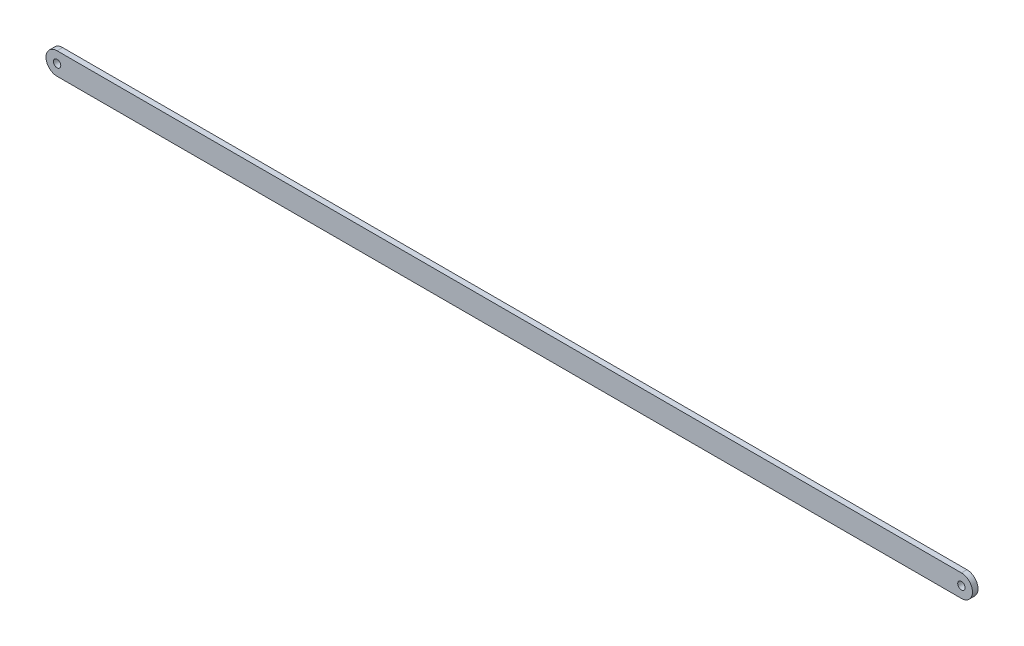
ISO-10303-21;
HEADER;
FILE_DESCRIPTION(('STEP AP214'),'2;1');
FILE_NAME('part.step','',(''),(''),'','','');
FILE_SCHEMA(('AUTOMOTIVE_DESIGN { 1 0 10303 214 1 1 1 1 }'));
ENDSEC;
DATA;
#1=APPLICATION_CONTEXT('core data for automotive mechanical design processes');
#2=APPLICATION_PROTOCOL_DEFINITION('international standard','automotive_design',2000,#1);
#3=PRODUCT_CONTEXT('',#1,'mechanical');
#4=PRODUCT('Part','Part','',(#3));
#5=PRODUCT_RELATED_PRODUCT_CATEGORY('part','',(#4));
#6=PRODUCT_DEFINITION_FORMATION('','',#4);
#7=PRODUCT_DEFINITION_CONTEXT('part definition',#1,'design');
#8=PRODUCT_DEFINITION('design','',#6,#7);
#9=PRODUCT_DEFINITION_SHAPE('','',#8);
#10=(LENGTH_UNIT() NAMED_UNIT(*) SI_UNIT(.MILLI.,.METRE.));
#11=(NAMED_UNIT(*) PLANE_ANGLE_UNIT() SI_UNIT($,.RADIAN.));
#12=(NAMED_UNIT(*) SI_UNIT($,.STERADIAN.) SOLID_ANGLE_UNIT());
#13=UNCERTAINTY_MEASURE_WITH_UNIT(LENGTH_MEASURE(1.E-05),#10,'distance_accuracy_value','');
#14=(GEOMETRIC_REPRESENTATION_CONTEXT(3) GLOBAL_UNCERTAINTY_ASSIGNED_CONTEXT((#13)) GLOBAL_UNIT_ASSIGNED_CONTEXT((#10,
#11,#12)) REPRESENTATION_CONTEXT('',''));
#15=CARTESIAN_POINT('',(0.,0.,0.));
#16=DIRECTION('',(0.,0.,1.));
#17=DIRECTION('',(1.,0.,0.));
#18=AXIS2_PLACEMENT_3D('',#15,#16,#17);
#19=CARTESIAN_POINT('',(-35.3127241673783,0.,3.));
#20=DIRECTION('',(0.,0.,1.));
#21=DIRECTION('',(1.,0.,0.));
#22=AXIS2_PLACEMENT_3D('',#19,#20,#21);
#23=PLANE('',#22);
#24=CARTESIAN_POINT('',(-35.3127241673783,0.,3.));
#25=DIRECTION('',(0.,0.,1.));
#26=DIRECTION('',(1.,0.,0.));
#27=AXIS2_PLACEMENT_3D('',#24,#25,#26);
#28=CIRCLE('',#27,2.);
#29=CARTESIAN_POINT('',(-33.3127241673783,0.,3.));
#30=VERTEX_POINT('',#29);
#31=EDGE_CURVE('E100',#30,#30,#28,.T.);
#32=ORIENTED_EDGE('',*,*,#31,.F.);
#33=EDGE_LOOP('',(#32));
#34=FACE_BOUND('',#33,.T.);
#35=CARTESIAN_POINT('',(-35.3127241673783,0.,3.));
#36=DIRECTION('',(0.,0.,1.));
#37=DIRECTION('',(1.,0.,0.));
#38=AXIS2_PLACEMENT_3D('',#35,#36,#37);
#39=CIRCLE('',#38,6.);
#40=CARTESIAN_POINT('',(-35.3127241673783,6.,3.));
#41=VERTEX_POINT('',#40);
#42=CARTESIAN_POINT('',(-35.3127241673783,-6.,3.));
#43=VERTEX_POINT('',#42);
#44=EDGE_CURVE('E85',#41,#43,#39,.T.);
#45=ORIENTED_EDGE('',*,*,#44,.T.);
#46=DIRECTION('',(1.,0.,0.));
#47=VECTOR('',#46,1.);
#48=CARTESIAN_POINT('',(-35.3127241673783,-6.,3.));
#49=LINE('',#48,#47);
#50=CARTESIAN_POINT('',(454.687275832622,-6.,3.));
#51=VERTEX_POINT('',#50);
#52=EDGE_CURVE('E80',#43,#51,#49,.T.);
#53=ORIENTED_EDGE('',*,*,#52,.T.);
#54=CARTESIAN_POINT('',(454.687275832622,0.,3.));
#55=DIRECTION('',(0.,0.,1.));
#56=DIRECTION('',(1.,0.,0.));
#57=AXIS2_PLACEMENT_3D('',#54,#55,#56);
#58=CIRCLE('',#57,6.);
#59=CARTESIAN_POINT('',(454.687275832622,6.,3.));
#60=VERTEX_POINT('',#59);
#61=EDGE_CURVE('E83',#51,#60,#58,.T.);
#62=ORIENTED_EDGE('',*,*,#61,.T.);
#63=DIRECTION('',(-1.,0.,0.));
#64=VECTOR('',#63,1.);
#65=CARTESIAN_POINT('',(-35.3127241673783,6.,3.));
#66=LINE('',#65,#64);
#67=EDGE_CURVE('E50',#60,#41,#66,.T.);
#68=ORIENTED_EDGE('',*,*,#67,.T.);
#69=EDGE_LOOP('',(#45,#53,#62,#68));
#70=FACE_BOUND('',#69,.T.);
#71=CARTESIAN_POINT('',(454.687275832622,0.,3.));
#72=DIRECTION('',(0.,0.,1.));
#73=DIRECTION('',(1.,0.,0.));
#74=AXIS2_PLACEMENT_3D('',#71,#72,#73);
#75=CIRCLE('',#74,2.);
#76=CARTESIAN_POINT('',(456.687275832622,0.,3.));
#77=VERTEX_POINT('',#76);
#78=EDGE_CURVE('E115',#77,#77,#75,.T.);
#79=ORIENTED_EDGE('',*,*,#78,.F.);
#80=EDGE_LOOP('',(#79));
#81=FACE_BOUND('',#80,.T.);
#82=ADVANCED_FACE('F33',(#34,#70,#81),#23,.T.);
#83=CARTESIAN_POINT('',(-35.3127241673783,0.,0.));
#84=DIRECTION('',(0.,0.,1.));
#85=DIRECTION('',(1.,0.,0.));
#86=AXIS2_PLACEMENT_3D('',#83,#84,#85);
#87=PLANE('',#86);
#88=CARTESIAN_POINT('',(-35.3127241673783,0.,0.));
#89=DIRECTION('',(0.,0.,1.));
#90=DIRECTION('',(1.,0.,0.));
#91=AXIS2_PLACEMENT_3D('',#88,#89,#90);
#92=CIRCLE('',#91,2.);
#93=CARTESIAN_POINT('',(-33.3127241673783,0.,0.));
#94=VERTEX_POINT('',#93);
#95=EDGE_CURVE('E112',#94,#94,#92,.T.);
#96=ORIENTED_EDGE('',*,*,#95,.T.);
#97=EDGE_LOOP('',(#96));
#98=FACE_BOUND('',#97,.T.);
#99=CARTESIAN_POINT('',(-35.3127241673783,0.,0.));
#100=DIRECTION('',(0.,0.,1.));
#101=DIRECTION('',(1.,0.,0.));
#102=AXIS2_PLACEMENT_3D('',#99,#100,#101);
#103=CIRCLE('',#102,6.);
#104=CARTESIAN_POINT('',(-35.3127241673783,6.,0.));
#105=VERTEX_POINT('',#104);
#106=CARTESIAN_POINT('',(-35.3127241673783,-6.,0.));
#107=VERTEX_POINT('',#106);
#108=EDGE_CURVE('E97',#105,#107,#103,.T.);
#109=ORIENTED_EDGE('',*,*,#108,.F.);
#110=DIRECTION('',(-1.,0.,0.));
#111=VECTOR('',#110,1.);
#112=CARTESIAN_POINT('',(-35.3127241673783,6.,0.));
#113=LINE('',#112,#111);
#114=CARTESIAN_POINT('',(454.687275832622,6.,0.));
#115=VERTEX_POINT('',#114);
#116=EDGE_CURVE('E73',#115,#105,#113,.T.);
#117=ORIENTED_EDGE('',*,*,#116,.F.);
#118=CARTESIAN_POINT('',(454.687275832622,0.,0.));
#119=DIRECTION('',(0.,0.,1.));
#120=DIRECTION('',(1.,0.,0.));
#121=AXIS2_PLACEMENT_3D('',#118,#119,#120);
#122=CIRCLE('',#121,6.);
#123=CARTESIAN_POINT('',(454.687275832622,-6.,0.));
#124=VERTEX_POINT('',#123);
#125=EDGE_CURVE('E67',#124,#115,#122,.T.);
#126=ORIENTED_EDGE('',*,*,#125,.F.);
#127=DIRECTION('',(1.,0.,0.));
#128=VECTOR('',#127,1.);
#129=CARTESIAN_POINT('',(-35.3127241673783,-6.,0.));
#130=LINE('',#129,#128);
#131=EDGE_CURVE('E89',#107,#124,#130,.T.);
#132=ORIENTED_EDGE('',*,*,#131,.F.);
#133=EDGE_LOOP('',(#109,#117,#126,#132));
#134=FACE_BOUND('',#133,.T.);
#135=CARTESIAN_POINT('',(454.687275832622,0.,0.));
#136=DIRECTION('',(0.,0.,1.));
#137=DIRECTION('',(1.,0.,0.));
#138=AXIS2_PLACEMENT_3D('',#135,#136,#137);
#139=CIRCLE('',#138,2.);
#140=CARTESIAN_POINT('',(456.687275832622,0.,0.));
#141=VERTEX_POINT('',#140);
#142=EDGE_CURVE('E118',#141,#141,#139,.T.);
#143=ORIENTED_EDGE('',*,*,#142,.T.);
#144=EDGE_LOOP('',(#143));
#145=FACE_BOUND('',#144,.T.);
#146=ADVANCED_FACE('F108',(#98,#134,#145),#87,.F.);
#147=CARTESIAN_POINT('',(-35.3127241673783,0.,3.));
#148=DIRECTION('',(0.,0.,-1.));
#149=DIRECTION('',(-1.,0.,0.));
#150=AXIS2_PLACEMENT_3D('',#147,#148,#149);
#151=CYLINDRICAL_SURFACE('',#150,6.);
#152=ORIENTED_EDGE('',*,*,#108,.T.);
#153=DIRECTION('',(0.,0.,-1.));
#154=VECTOR('',#153,1.);
#155=CARTESIAN_POINT('',(-35.3127241673783,-6.,3.));
#156=LINE('',#155,#154);
#157=EDGE_CURVE('E11',#43,#107,#156,.T.);
#158=ORIENTED_EDGE('',*,*,#157,.F.);
#159=ORIENTED_EDGE('',*,*,#44,.F.);
#160=DIRECTION('',(0.,0.,-1.));
#161=VECTOR('',#160,1.);
#162=CARTESIAN_POINT('',(-35.3127241673783,6.,3.));
#163=LINE('',#162,#161);
#164=EDGE_CURVE('E93',#41,#105,#163,.T.);
#165=ORIENTED_EDGE('',*,*,#164,.T.);
#166=EDGE_LOOP('',(#152,#158,#159,#165));
#167=FACE_BOUND('',#166,.T.);
#168=ADVANCED_FACE('F35',(#167),#151,.T.);
#169=CARTESIAN_POINT('',(-35.3127241673783,-6.,3.));
#170=DIRECTION('',(0.,1.,0.));
#171=DIRECTION('',(0.,0.,1.));
#172=AXIS2_PLACEMENT_3D('',#169,#170,#171);
#173=PLANE('',#172);
#174=ORIENTED_EDGE('',*,*,#131,.T.);
#175=DIRECTION('',(0.,0.,-1.));
#176=VECTOR('',#175,1.);
#177=CARTESIAN_POINT('',(454.687275832622,-6.,3.));
#178=LINE('',#177,#176);
#179=EDGE_CURVE('E42',#51,#124,#178,.T.);
#180=ORIENTED_EDGE('',*,*,#179,.F.);
#181=ORIENTED_EDGE('',*,*,#52,.F.);
#182=ORIENTED_EDGE('',*,*,#157,.T.);
#183=EDGE_LOOP('',(#174,#180,#181,#182));
#184=FACE_BOUND('',#183,.T.);
#185=ADVANCED_FACE('F88',(#184),#173,.F.);
#186=CARTESIAN_POINT('',(454.687275832622,0.,3.));
#187=DIRECTION('',(0.,0.,-1.));
#188=DIRECTION('',(-1.,0.,0.));
#189=AXIS2_PLACEMENT_3D('',#186,#187,#188);
#190=CYLINDRICAL_SURFACE('',#189,6.);
#191=ORIENTED_EDGE('',*,*,#125,.T.);
#192=DIRECTION('',(0.,0.,-1.));
#193=VECTOR('',#192,1.);
#194=CARTESIAN_POINT('',(454.687275832622,6.,3.));
#195=LINE('',#194,#193);
#196=EDGE_CURVE('E90',#60,#115,#195,.T.);
#197=ORIENTED_EDGE('',*,*,#196,.F.);
#198=ORIENTED_EDGE('',*,*,#61,.F.);
#199=ORIENTED_EDGE('',*,*,#179,.T.);
#200=EDGE_LOOP('',(#191,#197,#198,#199));
#201=FACE_BOUND('',#200,.T.);
#202=ADVANCED_FACE('F91',(#201),#190,.T.);
#203=CARTESIAN_POINT('',(-35.3127241673783,6.,3.));
#204=DIRECTION('',(0.,-1.,0.));
#205=DIRECTION('',(0.,0.,-1.));
#206=AXIS2_PLACEMENT_3D('',#203,#204,#205);
#207=PLANE('',#206);
#208=ORIENTED_EDGE('',*,*,#116,.T.);
#209=ORIENTED_EDGE('',*,*,#164,.F.);
#210=ORIENTED_EDGE('',*,*,#67,.F.);
#211=ORIENTED_EDGE('',*,*,#196,.T.);
#212=EDGE_LOOP('',(#208,#209,#210,#211));
#213=FACE_BOUND('',#212,.T.);
#214=ADVANCED_FACE('F105',(#213),#207,.F.);
#215=CARTESIAN_POINT('',(-35.3127241673783,0.,3.));
#216=DIRECTION('',(0.,0.,-1.));
#217=DIRECTION('',(-1.,0.,0.));
#218=AXIS2_PLACEMENT_3D('',#215,#216,#217);
#219=CYLINDRICAL_SURFACE('',#218,2.);
#220=ORIENTED_EDGE('',*,*,#31,.T.);
#221=EDGE_LOOP('',(#220));
#222=FACE_BOUND('',#221,.T.);
#223=ORIENTED_EDGE('',*,*,#95,.F.);
#224=EDGE_LOOP('',(#223));
#225=FACE_BOUND('',#224,.T.);
#226=ADVANCED_FACE('F136',(#222,#225),#219,.F.);
#227=CARTESIAN_POINT('',(454.687275832622,0.,3.));
#228=DIRECTION('',(0.,0.,-1.));
#229=DIRECTION('',(-1.,0.,0.));
#230=AXIS2_PLACEMENT_3D('',#227,#228,#229);
#231=CYLINDRICAL_SURFACE('',#230,2.);
#232=ORIENTED_EDGE('',*,*,#78,.T.);
#233=EDGE_LOOP('',(#232));
#234=FACE_BOUND('',#233,.T.);
#235=ORIENTED_EDGE('',*,*,#142,.F.);
#236=EDGE_LOOP('',(#235));
#237=FACE_BOUND('',#236,.T.);
#238=ADVANCED_FACE('F124',(#234,#237),#231,.F.);
#239=CLOSED_SHELL('',(#82,#146,#168,#185,#202,#214,#226,#238));
#240=MANIFOLD_SOLID_BREP('B2',#239);
#241=ADVANCED_BREP_SHAPE_REPRESENTATION('',(#18,#240),#14);
#242=SHAPE_DEFINITION_REPRESENTATION(#9,#241);
ENDSEC;
END-ISO-10303-21;
